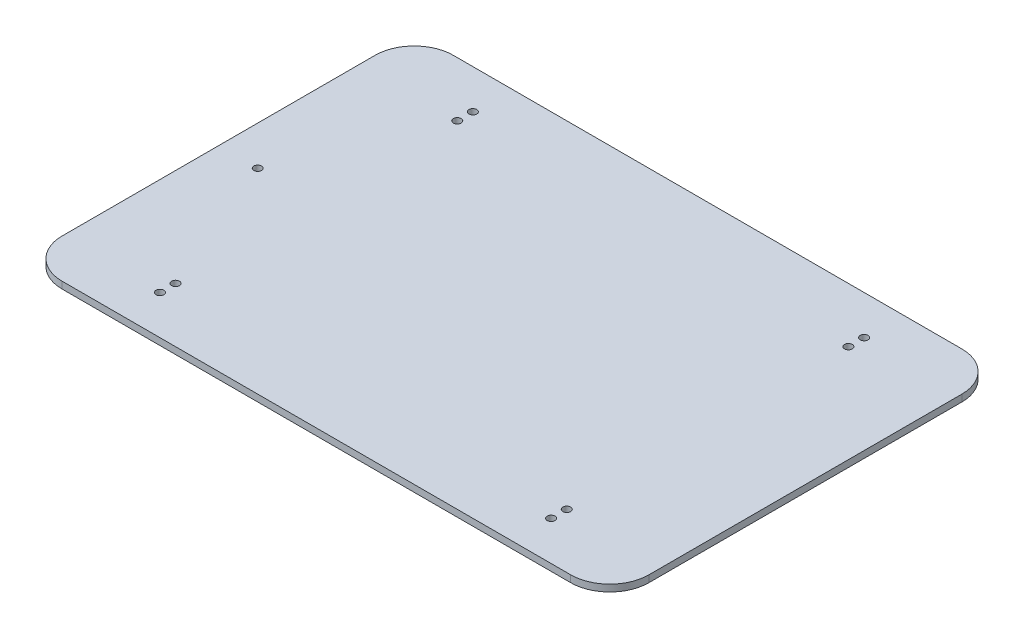
ISO-10303-21;
HEADER;
FILE_DESCRIPTION(('STEP AP214'),'2;1');
FILE_NAME('part.step','',(''),(''),'','','');
FILE_SCHEMA(('AUTOMOTIVE_DESIGN { 1 0 10303 214 1 1 1 1 }'));
ENDSEC;
DATA;
#1=APPLICATION_CONTEXT('core data for automotive mechanical design processes');
#2=APPLICATION_PROTOCOL_DEFINITION('international standard','automotive_design',2000,#1);
#3=PRODUCT_CONTEXT('',#1,'mechanical');
#4=PRODUCT('Part','Part','',(#3));
#5=PRODUCT_RELATED_PRODUCT_CATEGORY('part','',(#4));
#6=PRODUCT_DEFINITION_FORMATION('','',#4);
#7=PRODUCT_DEFINITION_CONTEXT('part definition',#1,'design');
#8=PRODUCT_DEFINITION('design','',#6,#7);
#9=PRODUCT_DEFINITION_SHAPE('','',#8);
#10=(LENGTH_UNIT() NAMED_UNIT(*) SI_UNIT(.MILLI.,.METRE.));
#11=(NAMED_UNIT(*) PLANE_ANGLE_UNIT() SI_UNIT($,.RADIAN.));
#12=(NAMED_UNIT(*) SI_UNIT($,.STERADIAN.) SOLID_ANGLE_UNIT());
#13=UNCERTAINTY_MEASURE_WITH_UNIT(LENGTH_MEASURE(1.E-05),#10,'distance_accuracy_value','');
#14=(GEOMETRIC_REPRESENTATION_CONTEXT(3) GLOBAL_UNCERTAINTY_ASSIGNED_CONTEXT((#13)) GLOBAL_UNIT_ASSIGNED_CONTEXT((#10,
#11,#12)) REPRESENTATION_CONTEXT('',''));
#15=CARTESIAN_POINT('',(0.,0.,0.));
#16=DIRECTION('',(0.,0.,1.));
#17=DIRECTION('',(1.,0.,0.));
#18=AXIS2_PLACEMENT_3D('',#15,#16,#17);
#19=CARTESIAN_POINT('',(130.,3.5,-80.));
#20=DIRECTION('',(0.,1.,0.));
#21=DIRECTION('',(0.,0.,1.));
#22=AXIS2_PLACEMENT_3D('',#19,#20,#21);
#23=PLANE('',#22);
#24=CARTESIAN_POINT('',(100.,3.5,-72.));
#25=DIRECTION('',(0.,1.,0.));
#26=DIRECTION('',(0.,0.,-1.));
#27=AXIS2_PLACEMENT_3D('',#24,#25,#26);
#28=CIRCLE('',#27,2.);
#29=CARTESIAN_POINT('',(100.,3.5,-74.));
#30=VERTEX_POINT('',#29);
#31=EDGE_CURVE('E300',#30,#30,#28,.T.);
#32=ORIENTED_EDGE('',*,*,#31,.F.);
#33=EDGE_LOOP('',(#32));
#34=FACE_BOUND('',#33,.T.);
#35=CARTESIAN_POINT('',(100.,3.5,72.));
#36=DIRECTION('',(0.,1.,0.));
#37=DIRECTION('',(0.,0.,1.));
#38=AXIS2_PLACEMENT_3D('',#35,#36,#37);
#39=CIRCLE('',#38,2.);
#40=CARTESIAN_POINT('',(100.,3.5,74.));
#41=VERTEX_POINT('',#40);
#42=EDGE_CURVE('E296',#41,#41,#39,.T.);
#43=ORIENTED_EDGE('',*,*,#42,.F.);
#44=EDGE_LOOP('',(#43));
#45=FACE_BOUND('',#44,.T.);
#46=CARTESIAN_POINT('',(-100.,3.5,72.));
#47=DIRECTION('',(0.,1.,0.));
#48=DIRECTION('',(0.,0.,-1.));
#49=AXIS2_PLACEMENT_3D('',#46,#47,#48);
#50=CIRCLE('',#49,2.);
#51=CARTESIAN_POINT('',(-100.,3.5,70.));
#52=VERTEX_POINT('',#51);
#53=EDGE_CURVE('E289',#52,#52,#50,.T.);
#54=ORIENTED_EDGE('',*,*,#53,.F.);
#55=EDGE_LOOP('',(#54));
#56=FACE_BOUND('',#55,.T.);
#57=CARTESIAN_POINT('',(-100.,3.5,-72.));
#58=DIRECTION('',(0.,1.,0.));
#59=DIRECTION('',(0.,0.,1.));
#60=AXIS2_PLACEMENT_3D('',#57,#58,#59);
#61=CIRCLE('',#60,2.);
#62=CARTESIAN_POINT('',(-100.,3.5,-70.));
#63=VERTEX_POINT('',#62);
#64=EDGE_CURVE('E167',#63,#63,#61,.T.);
#65=ORIENTED_EDGE('',*,*,#64,.F.);
#66=EDGE_LOOP('',(#65));
#67=FACE_BOUND('',#66,.T.);
#68=CARTESIAN_POINT('',(-100.,3.5,80.));
#69=DIRECTION('',(0.,1.,0.));
#70=DIRECTION('',(0.,0.,1.));
#71=AXIS2_PLACEMENT_3D('',#68,#69,#70);
#72=CIRCLE('',#71,2.);
#73=CARTESIAN_POINT('',(-100.,3.5,82.));
#74=VERTEX_POINT('',#73);
#75=EDGE_CURVE('E187',#74,#74,#72,.T.);
#76=ORIENTED_EDGE('',*,*,#75,.F.);
#77=EDGE_LOOP('',(#76));
#78=FACE_BOUND('',#77,.T.);
#79=CARTESIAN_POINT('',(100.,3.5,-80.));
#80=DIRECTION('',(0.,1.,0.));
#81=DIRECTION('',(0.,0.,1.));
#82=AXIS2_PLACEMENT_3D('',#79,#80,#81);
#83=CIRCLE('',#82,2.);
#84=CARTESIAN_POINT('',(100.,3.5,-78.));
#85=VERTEX_POINT('',#84);
#86=EDGE_CURVE('E199',#85,#85,#83,.T.);
#87=ORIENTED_EDGE('',*,*,#86,.F.);
#88=EDGE_LOOP('',(#87));
#89=FACE_BOUND('',#88,.T.);
#90=CARTESIAN_POINT('',(130.,3.5,-80.));
#91=DIRECTION('',(0.,1.,0.));
#92=DIRECTION('',(0.,0.,1.));
#93=AXIS2_PLACEMENT_3D('',#90,#91,#92);
#94=CIRCLE('',#93,20.);
#95=CARTESIAN_POINT('',(150.,3.5,-80.));
#96=VERTEX_POINT('',#95);
#97=CARTESIAN_POINT('',(130.,3.5,-100.));
#98=VERTEX_POINT('',#97);
#99=EDGE_CURVE('E151',#96,#98,#94,.T.);
#100=ORIENTED_EDGE('',*,*,#99,.T.);
#101=DIRECTION('',(-1.,0.,0.));
#102=VECTOR('',#101,1.);
#103=CARTESIAN_POINT('',(130.,3.5,-100.));
#104=LINE('',#103,#102);
#105=CARTESIAN_POINT('',(-130.,3.5,-100.));
#106=VERTEX_POINT('',#105);
#107=EDGE_CURVE('E99',#98,#106,#104,.T.);
#108=ORIENTED_EDGE('',*,*,#107,.T.);
#109=CARTESIAN_POINT('',(-130.,3.5,-80.));
#110=DIRECTION('',(0.,1.,0.));
#111=DIRECTION('',(0.,0.,1.));
#112=AXIS2_PLACEMENT_3D('',#109,#110,#111);
#113=CIRCLE('',#112,20.);
#114=CARTESIAN_POINT('',(-150.,3.5,-80.));
#115=VERTEX_POINT('',#114);
#116=EDGE_CURVE('E211',#106,#115,#113,.T.);
#117=ORIENTED_EDGE('',*,*,#116,.T.);
#118=DIRECTION('',(0.,0.,1.));
#119=VECTOR('',#118,1.);
#120=CARTESIAN_POINT('',(-150.,3.5,80.));
#121=LINE('',#120,#119);
#122=CARTESIAN_POINT('',(-150.,3.5,80.));
#123=VERTEX_POINT('',#122);
#124=EDGE_CURVE('E213',#115,#123,#121,.T.);
#125=ORIENTED_EDGE('',*,*,#124,.T.);
#126=CARTESIAN_POINT('',(-130.,3.5,80.));
#127=DIRECTION('',(0.,1.,0.));
#128=DIRECTION('',(0.,0.,-1.));
#129=AXIS2_PLACEMENT_3D('',#126,#127,#128);
#130=CIRCLE('',#129,20.);
#131=CARTESIAN_POINT('',(-130.,3.5,100.));
#132=VERTEX_POINT('',#131);
#133=EDGE_CURVE('E118',#123,#132,#130,.T.);
#134=ORIENTED_EDGE('',*,*,#133,.T.);
#135=DIRECTION('',(1.,0.,0.));
#136=VECTOR('',#135,1.);
#137=CARTESIAN_POINT('',(130.,3.5,100.));
#138=LINE('',#137,#136);
#139=CARTESIAN_POINT('',(130.,3.5,100.));
#140=VERTEX_POINT('',#139);
#141=EDGE_CURVE('E112',#132,#140,#138,.T.);
#142=ORIENTED_EDGE('',*,*,#141,.T.);
#143=CARTESIAN_POINT('',(130.,3.5,80.));
#144=DIRECTION('',(0.,1.,0.));
#145=DIRECTION('',(0.,0.,1.));
#146=AXIS2_PLACEMENT_3D('',#143,#144,#145);
#147=CIRCLE('',#146,20.);
#148=CARTESIAN_POINT('',(150.,3.5,80.));
#149=VERTEX_POINT('',#148);
#150=EDGE_CURVE('E116',#140,#149,#147,.T.);
#151=ORIENTED_EDGE('',*,*,#150,.T.);
#152=DIRECTION('',(0.,0.,-1.));
#153=VECTOR('',#152,1.);
#154=CARTESIAN_POINT('',(150.,3.5,80.));
#155=LINE('',#154,#153);
#156=EDGE_CURVE('E56',#149,#96,#155,.T.);
#157=ORIENTED_EDGE('',*,*,#156,.T.);
#158=EDGE_LOOP('',(#100,#108,#117,#125,#134,#142,#151,#157));
#159=FACE_BOUND('',#158,.T.);
#160=CARTESIAN_POINT('',(-100.,3.5,-80.));
#161=DIRECTION('',(0.,1.,0.));
#162=DIRECTION('',(0.,0.,1.));
#163=AXIS2_PLACEMENT_3D('',#160,#161,#162);
#164=CIRCLE('',#163,2.);
#165=CARTESIAN_POINT('',(-100.,3.5,-78.));
#166=VERTEX_POINT('',#165);
#167=EDGE_CURVE('E140',#166,#166,#164,.T.);
#168=ORIENTED_EDGE('',*,*,#167,.F.);
#169=EDGE_LOOP('',(#168));
#170=FACE_BOUND('',#169,.T.);
#171=CARTESIAN_POINT('',(100.,3.5,80.));
#172=DIRECTION('',(0.,1.,0.));
#173=DIRECTION('',(0.,0.,1.));
#174=AXIS2_PLACEMENT_3D('',#171,#172,#173);
#175=CIRCLE('',#174,2.);
#176=CARTESIAN_POINT('',(100.,3.5,82.));
#177=VERTEX_POINT('',#176);
#178=EDGE_CURVE('E193',#177,#177,#175,.T.);
#179=ORIENTED_EDGE('',*,*,#178,.F.);
#180=EDGE_LOOP('',(#179));
#181=FACE_BOUND('',#180,.T.);
#182=CARTESIAN_POINT('',(-130.,3.5,0.));
#183=DIRECTION('',(0.,1.,0.));
#184=DIRECTION('',(0.,0.,1.));
#185=AXIS2_PLACEMENT_3D('',#182,#183,#184);
#186=CIRCLE('',#185,2.);
#187=CARTESIAN_POINT('',(-130.,3.5,2.));
#188=VERTEX_POINT('',#187);
#189=EDGE_CURVE('E178',#188,#188,#186,.T.);
#190=ORIENTED_EDGE('',*,*,#189,.F.);
#191=EDGE_LOOP('',(#190));
#192=FACE_BOUND('',#191,.T.);
#193=ADVANCED_FACE('F37',(#34,#45,#56,#67,#78,#89,#159,#170,#181,#192),#23,.T.);
#194=CARTESIAN_POINT('',(130.,0.,-80.));
#195=DIRECTION('',(0.,1.,0.));
#196=DIRECTION('',(0.,0.,1.));
#197=AXIS2_PLACEMENT_3D('',#194,#195,#196);
#198=PLANE('',#197);
#199=CARTESIAN_POINT('',(100.,0.,-72.));
#200=DIRECTION('',(0.,1.,0.));
#201=DIRECTION('',(0.,0.,1.));
#202=AXIS2_PLACEMENT_3D('',#199,#200,#201);
#203=CIRCLE('',#202,2.);
#204=CARTESIAN_POINT('',(100.,0.,-70.));
#205=VERTEX_POINT('',#204);
#206=EDGE_CURVE('E41',#205,#205,#203,.T.);
#207=ORIENTED_EDGE('',*,*,#206,.T.);
#208=EDGE_LOOP('',(#207));
#209=FACE_BOUND('',#208,.T.);
#210=CARTESIAN_POINT('',(100.,0.,72.));
#211=DIRECTION('',(0.,1.,0.));
#212=DIRECTION('',(0.,0.,1.));
#213=AXIS2_PLACEMENT_3D('',#210,#211,#212);
#214=CIRCLE('',#213,2.);
#215=CARTESIAN_POINT('',(100.,0.,74.));
#216=VERTEX_POINT('',#215);
#217=EDGE_CURVE('E169',#216,#216,#214,.T.);
#218=ORIENTED_EDGE('',*,*,#217,.T.);
#219=EDGE_LOOP('',(#218));
#220=FACE_BOUND('',#219,.T.);
#221=CARTESIAN_POINT('',(-100.,0.,72.));
#222=DIRECTION('',(0.,1.,0.));
#223=DIRECTION('',(0.,0.,1.));
#224=AXIS2_PLACEMENT_3D('',#221,#222,#223);
#225=CIRCLE('',#224,2.);
#226=CARTESIAN_POINT('',(-100.,0.,74.));
#227=VERTEX_POINT('',#226);
#228=EDGE_CURVE('E166',#227,#227,#225,.T.);
#229=ORIENTED_EDGE('',*,*,#228,.T.);
#230=EDGE_LOOP('',(#229));
#231=FACE_BOUND('',#230,.T.);
#232=CARTESIAN_POINT('',(-100.,0.,-72.));
#233=DIRECTION('',(0.,1.,0.));
#234=DIRECTION('',(0.,0.,1.));
#235=AXIS2_PLACEMENT_3D('',#232,#233,#234);
#236=CIRCLE('',#235,2.);
#237=CARTESIAN_POINT('',(-100.,0.,-70.));
#238=VERTEX_POINT('',#237);
#239=EDGE_CURVE('E163',#238,#238,#236,.T.);
#240=ORIENTED_EDGE('',*,*,#239,.T.);
#241=EDGE_LOOP('',(#240));
#242=FACE_BOUND('',#241,.T.);
#243=CARTESIAN_POINT('',(130.,0.,-80.));
#244=DIRECTION('',(0.,1.,0.));
#245=DIRECTION('',(0.,0.,1.));
#246=AXIS2_PLACEMENT_3D('',#243,#244,#245);
#247=CIRCLE('',#246,20.);
#248=CARTESIAN_POINT('',(150.,0.,-80.));
#249=VERTEX_POINT('',#248);
#250=CARTESIAN_POINT('',(130.,0.,-100.));
#251=VERTEX_POINT('',#250);
#252=EDGE_CURVE('E136',#249,#251,#247,.T.);
#253=ORIENTED_EDGE('',*,*,#252,.F.);
#254=DIRECTION('',(0.,0.,-1.));
#255=VECTOR('',#254,1.);
#256=CARTESIAN_POINT('',(150.,0.,80.));
#257=LINE('',#256,#255);
#258=CARTESIAN_POINT('',(150.,0.,80.));
#259=VERTEX_POINT('',#258);
#260=EDGE_CURVE('E91',#259,#249,#257,.T.);
#261=ORIENTED_EDGE('',*,*,#260,.F.);
#262=CARTESIAN_POINT('',(130.,0.,80.));
#263=DIRECTION('',(0.,1.,0.));
#264=DIRECTION('',(0.,0.,1.));
#265=AXIS2_PLACEMENT_3D('',#262,#263,#264);
#266=CIRCLE('',#265,20.);
#267=CARTESIAN_POINT('',(130.,0.,100.));
#268=VERTEX_POINT('',#267);
#269=EDGE_CURVE('E85',#268,#259,#266,.T.);
#270=ORIENTED_EDGE('',*,*,#269,.F.);
#271=DIRECTION('',(1.,0.,0.));
#272=VECTOR('',#271,1.);
#273=CARTESIAN_POINT('',(130.,0.,100.));
#274=LINE('',#273,#272);
#275=CARTESIAN_POINT('',(-130.,0.,100.));
#276=VERTEX_POINT('',#275);
#277=EDGE_CURVE('E126',#276,#268,#274,.T.);
#278=ORIENTED_EDGE('',*,*,#277,.F.);
#279=CARTESIAN_POINT('',(-130.,0.,80.));
#280=DIRECTION('',(0.,1.,0.));
#281=DIRECTION('',(0.,0.,-1.));
#282=AXIS2_PLACEMENT_3D('',#279,#280,#281);
#283=CIRCLE('',#282,20.);
#284=CARTESIAN_POINT('',(-150.,0.,80.));
#285=VERTEX_POINT('',#284);
#286=EDGE_CURVE('E146',#285,#276,#283,.T.);
#287=ORIENTED_EDGE('',*,*,#286,.F.);
#288=DIRECTION('',(0.,0.,1.));
#289=VECTOR('',#288,1.);
#290=CARTESIAN_POINT('',(-150.,0.,80.));
#291=LINE('',#290,#289);
#292=CARTESIAN_POINT('',(-150.,0.,-80.));
#293=VERTEX_POINT('',#292);
#294=EDGE_CURVE('E144',#293,#285,#291,.T.);
#295=ORIENTED_EDGE('',*,*,#294,.F.);
#296=CARTESIAN_POINT('',(-130.,0.,-80.));
#297=DIRECTION('',(0.,1.,0.));
#298=DIRECTION('',(0.,0.,1.));
#299=AXIS2_PLACEMENT_3D('',#296,#297,#298);
#300=CIRCLE('',#299,20.);
#301=CARTESIAN_POINT('',(-130.,0.,-100.));
#302=VERTEX_POINT('',#301);
#303=EDGE_CURVE('E142',#302,#293,#300,.T.);
#304=ORIENTED_EDGE('',*,*,#303,.F.);
#305=DIRECTION('',(-1.,0.,0.));
#306=VECTOR('',#305,1.);
#307=CARTESIAN_POINT('',(130.,0.,-100.));
#308=LINE('',#307,#306);
#309=EDGE_CURVE('E139',#251,#302,#308,.T.);
#310=ORIENTED_EDGE('',*,*,#309,.F.);
#311=EDGE_LOOP('',(#253,#261,#270,#278,#287,#295,#304,#310));
#312=FACE_BOUND('',#311,.T.);
#313=CARTESIAN_POINT('',(-100.,0.,-80.));
#314=DIRECTION('',(0.,1.,0.));
#315=DIRECTION('',(0.,0.,1.));
#316=AXIS2_PLACEMENT_3D('',#313,#314,#315);
#317=CIRCLE('',#316,2.);
#318=CARTESIAN_POINT('',(-100.,0.,-78.));
#319=VERTEX_POINT('',#318);
#320=EDGE_CURVE('E202',#319,#319,#317,.T.);
#321=ORIENTED_EDGE('',*,*,#320,.T.);
#322=EDGE_LOOP('',(#321));
#323=FACE_BOUND('',#322,.T.);
#324=CARTESIAN_POINT('',(100.,0.,-80.));
#325=DIRECTION('',(0.,1.,0.));
#326=DIRECTION('',(0.,0.,1.));
#327=AXIS2_PLACEMENT_3D('',#324,#325,#326);
#328=CIRCLE('',#327,2.);
#329=CARTESIAN_POINT('',(100.,0.,-78.));
#330=VERTEX_POINT('',#329);
#331=EDGE_CURVE('E196',#330,#330,#328,.T.);
#332=ORIENTED_EDGE('',*,*,#331,.T.);
#333=EDGE_LOOP('',(#332));
#334=FACE_BOUND('',#333,.T.);
#335=CARTESIAN_POINT('',(100.,0.,80.));
#336=DIRECTION('',(0.,1.,0.));
#337=DIRECTION('',(0.,0.,1.));
#338=AXIS2_PLACEMENT_3D('',#335,#336,#337);
#339=CIRCLE('',#338,2.);
#340=CARTESIAN_POINT('',(100.,0.,82.));
#341=VERTEX_POINT('',#340);
#342=EDGE_CURVE('E190',#341,#341,#339,.T.);
#343=ORIENTED_EDGE('',*,*,#342,.T.);
#344=EDGE_LOOP('',(#343));
#345=FACE_BOUND('',#344,.T.);
#346=CARTESIAN_POINT('',(-100.,0.,80.));
#347=DIRECTION('',(0.,1.,0.));
#348=DIRECTION('',(0.,0.,1.));
#349=AXIS2_PLACEMENT_3D('',#346,#347,#348);
#350=CIRCLE('',#349,2.);
#351=CARTESIAN_POINT('',(-100.,0.,82.));
#352=VERTEX_POINT('',#351);
#353=EDGE_CURVE('E183',#352,#352,#350,.T.);
#354=ORIENTED_EDGE('',*,*,#353,.T.);
#355=EDGE_LOOP('',(#354));
#356=FACE_BOUND('',#355,.T.);
#357=CARTESIAN_POINT('',(-130.,0.,0.));
#358=DIRECTION('',(0.,1.,0.));
#359=DIRECTION('',(0.,0.,1.));
#360=AXIS2_PLACEMENT_3D('',#357,#358,#359);
#361=CIRCLE('',#360,2.);
#362=CARTESIAN_POINT('',(-130.,0.,2.));
#363=VERTEX_POINT('',#362);
#364=EDGE_CURVE('E174',#363,#363,#361,.T.);
#365=ORIENTED_EDGE('',*,*,#364,.T.);
#366=EDGE_LOOP('',(#365));
#367=FACE_BOUND('',#366,.T.);
#368=ADVANCED_FACE('F226',(#209,#220,#231,#242,#312,#323,#334,#345,#356,#367),#198,.F.);
#369=CARTESIAN_POINT('',(130.,3.5,-80.));
#370=DIRECTION('',(0.,-1.,0.));
#371=DIRECTION('',(0.,0.,-1.));
#372=AXIS2_PLACEMENT_3D('',#369,#370,#371);
#373=CYLINDRICAL_SURFACE('',#372,20.);
#374=ORIENTED_EDGE('',*,*,#252,.T.);
#375=DIRECTION('',(0.,-1.,0.));
#376=VECTOR('',#375,1.);
#377=CARTESIAN_POINT('',(130.,3.5,-100.));
#378=LINE('',#377,#376);
#379=EDGE_CURVE('E11',#98,#251,#378,.T.);
#380=ORIENTED_EDGE('',*,*,#379,.F.);
#381=ORIENTED_EDGE('',*,*,#99,.F.);
#382=DIRECTION('',(0.,-1.,0.));
#383=VECTOR('',#382,1.);
#384=CARTESIAN_POINT('',(150.,3.5,-80.));
#385=LINE('',#384,#383);
#386=EDGE_CURVE('E132',#96,#249,#385,.T.);
#387=ORIENTED_EDGE('',*,*,#386,.T.);
#388=EDGE_LOOP('',(#374,#380,#381,#387));
#389=FACE_BOUND('',#388,.T.);
#390=ADVANCED_FACE('F39',(#389),#373,.T.);
#391=CARTESIAN_POINT('',(130.,3.5,-100.));
#392=DIRECTION('',(0.,0.,1.));
#393=DIRECTION('',(1.,0.,0.));
#394=AXIS2_PLACEMENT_3D('',#391,#392,#393);
#395=PLANE('',#394);
#396=ORIENTED_EDGE('',*,*,#309,.T.);
#397=DIRECTION('',(0.,-1.,0.));
#398=VECTOR('',#397,1.);
#399=CARTESIAN_POINT('',(-130.,3.5,-100.));
#400=LINE('',#399,#398);
#401=EDGE_CURVE('E47',#106,#302,#400,.T.);
#402=ORIENTED_EDGE('',*,*,#401,.F.);
#403=ORIENTED_EDGE('',*,*,#107,.F.);
#404=ORIENTED_EDGE('',*,*,#379,.T.);
#405=EDGE_LOOP('',(#396,#402,#403,#404));
#406=FACE_BOUND('',#405,.T.);
#407=ADVANCED_FACE('F348',(#406),#395,.F.);
#408=CARTESIAN_POINT('',(-130.,3.5,-80.));
#409=DIRECTION('',(0.,-1.,0.));
#410=DIRECTION('',(0.,0.,-1.));
#411=AXIS2_PLACEMENT_3D('',#408,#409,#410);
#412=CYLINDRICAL_SURFACE('',#411,20.);
#413=ORIENTED_EDGE('',*,*,#303,.T.);
#414=DIRECTION('',(0.,-1.,0.));
#415=VECTOR('',#414,1.);
#416=CARTESIAN_POINT('',(-150.,3.5,-80.));
#417=LINE('',#416,#415);
#418=EDGE_CURVE('E158',#115,#293,#417,.T.);
#419=ORIENTED_EDGE('',*,*,#418,.F.);
#420=ORIENTED_EDGE('',*,*,#116,.F.);
#421=ORIENTED_EDGE('',*,*,#401,.T.);
#422=EDGE_LOOP('',(#413,#419,#420,#421));
#423=FACE_BOUND('',#422,.T.);
#424=ADVANCED_FACE('F354',(#423),#412,.T.);
#425=CARTESIAN_POINT('',(-150.,3.5,80.));
#426=DIRECTION('',(1.,0.,0.));
#427=DIRECTION('',(0.,0.,-1.));
#428=AXIS2_PLACEMENT_3D('',#425,#426,#427);
#429=PLANE('',#428);
#430=ORIENTED_EDGE('',*,*,#294,.T.);
#431=DIRECTION('',(0.,-1.,0.));
#432=VECTOR('',#431,1.);
#433=CARTESIAN_POINT('',(-150.,3.5,80.));
#434=LINE('',#433,#432);
#435=EDGE_CURVE('E155',#123,#285,#434,.T.);
#436=ORIENTED_EDGE('',*,*,#435,.F.);
#437=ORIENTED_EDGE('',*,*,#124,.F.);
#438=ORIENTED_EDGE('',*,*,#418,.T.);
#439=EDGE_LOOP('',(#430,#436,#437,#438));
#440=FACE_BOUND('',#439,.T.);
#441=ADVANCED_FACE('F219',(#440),#429,.F.);
#442=CARTESIAN_POINT('',(-130.,3.5,80.));
#443=DIRECTION('',(0.,-1.,0.));
#444=DIRECTION('',(0.,0.,-1.));
#445=AXIS2_PLACEMENT_3D('',#442,#443,#444);
#446=CYLINDRICAL_SURFACE('',#445,20.);
#447=ORIENTED_EDGE('',*,*,#286,.T.);
#448=DIRECTION('',(0.,-1.,0.));
#449=VECTOR('',#448,1.);
#450=CARTESIAN_POINT('',(-130.,3.5,100.));
#451=LINE('',#450,#449);
#452=EDGE_CURVE('E127',#132,#276,#451,.T.);
#453=ORIENTED_EDGE('',*,*,#452,.F.);
#454=ORIENTED_EDGE('',*,*,#133,.F.);
#455=ORIENTED_EDGE('',*,*,#435,.T.);
#456=EDGE_LOOP('',(#447,#453,#454,#455));
#457=FACE_BOUND('',#456,.T.);
#458=ADVANCED_FACE('F223',(#457),#446,.T.);
#459=CARTESIAN_POINT('',(130.,3.5,100.));
#460=DIRECTION('',(0.,0.,-1.));
#461=DIRECTION('',(-1.,0.,0.));
#462=AXIS2_PLACEMENT_3D('',#459,#460,#461);
#463=PLANE('',#462);
#464=ORIENTED_EDGE('',*,*,#277,.T.);
#465=DIRECTION('',(0.,-1.,0.));
#466=VECTOR('',#465,1.);
#467=CARTESIAN_POINT('',(130.,3.5,100.));
#468=LINE('',#467,#466);
#469=EDGE_CURVE('E123',#140,#268,#468,.T.);
#470=ORIENTED_EDGE('',*,*,#469,.F.);
#471=ORIENTED_EDGE('',*,*,#141,.F.);
#472=ORIENTED_EDGE('',*,*,#452,.T.);
#473=EDGE_LOOP('',(#464,#470,#471,#472));
#474=FACE_BOUND('',#473,.T.);
#475=ADVANCED_FACE('F124',(#474),#463,.F.);
#476=CARTESIAN_POINT('',(130.,3.5,80.));
#477=DIRECTION('',(0.,-1.,0.));
#478=DIRECTION('',(0.,0.,-1.));
#479=AXIS2_PLACEMENT_3D('',#476,#477,#478);
#480=CYLINDRICAL_SURFACE('',#479,20.);
#481=ORIENTED_EDGE('',*,*,#269,.T.);
#482=DIRECTION('',(0.,-1.,0.));
#483=VECTOR('',#482,1.);
#484=CARTESIAN_POINT('',(150.,3.5,80.));
#485=LINE('',#484,#483);
#486=EDGE_CURVE('E128',#149,#259,#485,.T.);
#487=ORIENTED_EDGE('',*,*,#486,.F.);
#488=ORIENTED_EDGE('',*,*,#150,.F.);
#489=ORIENTED_EDGE('',*,*,#469,.T.);
#490=EDGE_LOOP('',(#481,#487,#488,#489));
#491=FACE_BOUND('',#490,.T.);
#492=ADVANCED_FACE('F130',(#491),#480,.T.);
#493=CARTESIAN_POINT('',(150.,3.5,80.));
#494=DIRECTION('',(-1.,0.,0.));
#495=DIRECTION('',(0.,0.,1.));
#496=AXIS2_PLACEMENT_3D('',#493,#494,#495);
#497=PLANE('',#496);
#498=ORIENTED_EDGE('',*,*,#260,.T.);
#499=ORIENTED_EDGE('',*,*,#386,.F.);
#500=ORIENTED_EDGE('',*,*,#156,.F.);
#501=ORIENTED_EDGE('',*,*,#486,.T.);
#502=EDGE_LOOP('',(#498,#499,#500,#501));
#503=FACE_BOUND('',#502,.T.);
#504=ADVANCED_FACE('F232',(#503),#497,.F.);
#505=CARTESIAN_POINT('',(-100.,3.5,-80.));
#506=DIRECTION('',(0.,-1.,0.));
#507=DIRECTION('',(0.,0.,-1.));
#508=AXIS2_PLACEMENT_3D('',#505,#506,#507);
#509=CYLINDRICAL_SURFACE('',#508,2.);
#510=ORIENTED_EDGE('',*,*,#167,.T.);
#511=EDGE_LOOP('',(#510));
#512=FACE_BOUND('',#511,.T.);
#513=ORIENTED_EDGE('',*,*,#320,.F.);
#514=EDGE_LOOP('',(#513));
#515=FACE_BOUND('',#514,.T.);
#516=ADVANCED_FACE('F234',(#512,#515),#509,.F.);
#517=CARTESIAN_POINT('',(100.,3.5,-80.));
#518=DIRECTION('',(0.,-1.,0.));
#519=DIRECTION('',(0.,0.,-1.));
#520=AXIS2_PLACEMENT_3D('',#517,#518,#519);
#521=CYLINDRICAL_SURFACE('',#520,2.);
#522=ORIENTED_EDGE('',*,*,#86,.T.);
#523=EDGE_LOOP('',(#522));
#524=FACE_BOUND('',#523,.T.);
#525=ORIENTED_EDGE('',*,*,#331,.F.);
#526=EDGE_LOOP('',(#525));
#527=FACE_BOUND('',#526,.T.);
#528=ADVANCED_FACE('F240',(#524,#527),#521,.F.);
#529=CARTESIAN_POINT('',(100.,3.5,80.));
#530=DIRECTION('',(0.,-1.,0.));
#531=DIRECTION('',(0.,0.,-1.));
#532=AXIS2_PLACEMENT_3D('',#529,#530,#531);
#533=CYLINDRICAL_SURFACE('',#532,2.);
#534=ORIENTED_EDGE('',*,*,#178,.T.);
#535=EDGE_LOOP('',(#534));
#536=FACE_BOUND('',#535,.T.);
#537=ORIENTED_EDGE('',*,*,#342,.F.);
#538=EDGE_LOOP('',(#537));
#539=FACE_BOUND('',#538,.T.);
#540=ADVANCED_FACE('F257',(#536,#539),#533,.F.);
#541=CARTESIAN_POINT('',(-100.,3.5,80.));
#542=DIRECTION('',(0.,-1.,0.));
#543=DIRECTION('',(0.,0.,-1.));
#544=AXIS2_PLACEMENT_3D('',#541,#542,#543);
#545=CYLINDRICAL_SURFACE('',#544,2.);
#546=ORIENTED_EDGE('',*,*,#75,.T.);
#547=EDGE_LOOP('',(#546));
#548=FACE_BOUND('',#547,.T.);
#549=ORIENTED_EDGE('',*,*,#353,.F.);
#550=EDGE_LOOP('',(#549));
#551=FACE_BOUND('',#550,.T.);
#552=ADVANCED_FACE('F261',(#548,#551),#545,.F.);
#553=CARTESIAN_POINT('',(-130.,3.5,0.));
#554=DIRECTION('',(0.,-1.,0.));
#555=DIRECTION('',(0.,0.,-1.));
#556=AXIS2_PLACEMENT_3D('',#553,#554,#555);
#557=CYLINDRICAL_SURFACE('',#556,2.);
#558=ORIENTED_EDGE('',*,*,#189,.T.);
#559=EDGE_LOOP('',(#558));
#560=FACE_BOUND('',#559,.T.);
#561=ORIENTED_EDGE('',*,*,#364,.F.);
#562=EDGE_LOOP('',(#561));
#563=FACE_BOUND('',#562,.T.);
#564=ADVANCED_FACE('F265',(#560,#563),#557,.F.);
#565=CARTESIAN_POINT('',(-100.,-6.5,-72.));
#566=DIRECTION('',(0.,1.,0.));
#567=DIRECTION('',(0.,0.,1.));
#568=AXIS2_PLACEMENT_3D('',#565,#566,#567);
#569=CYLINDRICAL_SURFACE('',#568,2.);
#570=ORIENTED_EDGE('',*,*,#64,.T.);
#571=EDGE_LOOP('',(#570));
#572=FACE_BOUND('',#571,.T.);
#573=ORIENTED_EDGE('',*,*,#239,.F.);
#574=EDGE_LOOP('',(#573));
#575=FACE_BOUND('',#574,.T.);
#576=ADVANCED_FACE('F268',(#572,#575),#569,.F.);
#577=CARTESIAN_POINT('',(-100.,-6.5,72.));
#578=DIRECTION('',(0.,1.,0.));
#579=DIRECTION('',(0.,0.,1.));
#580=AXIS2_PLACEMENT_3D('',#577,#578,#579);
#581=CYLINDRICAL_SURFACE('',#580,2.);
#582=ORIENTED_EDGE('',*,*,#53,.T.);
#583=EDGE_LOOP('',(#582));
#584=FACE_BOUND('',#583,.T.);
#585=ORIENTED_EDGE('',*,*,#228,.F.);
#586=EDGE_LOOP('',(#585));
#587=FACE_BOUND('',#586,.T.);
#588=ADVANCED_FACE('F272',(#584,#587),#581,.F.);
#589=CARTESIAN_POINT('',(100.,-6.5,72.));
#590=DIRECTION('',(0.,1.,0.));
#591=DIRECTION('',(0.,0.,1.));
#592=AXIS2_PLACEMENT_3D('',#589,#590,#591);
#593=CYLINDRICAL_SURFACE('',#592,2.);
#594=ORIENTED_EDGE('',*,*,#42,.T.);
#595=EDGE_LOOP('',(#594));
#596=FACE_BOUND('',#595,.T.);
#597=ORIENTED_EDGE('',*,*,#217,.F.);
#598=EDGE_LOOP('',(#597));
#599=FACE_BOUND('',#598,.T.);
#600=ADVANCED_FACE('F277',(#596,#599),#593,.F.);
#601=CARTESIAN_POINT('',(100.,-6.5,-72.));
#602=DIRECTION('',(0.,1.,0.));
#603=DIRECTION('',(0.,0.,1.));
#604=AXIS2_PLACEMENT_3D('',#601,#602,#603);
#605=CYLINDRICAL_SURFACE('',#604,2.);
#606=ORIENTED_EDGE('',*,*,#31,.T.);
#607=EDGE_LOOP('',(#606));
#608=FACE_BOUND('',#607,.T.);
#609=ORIENTED_EDGE('',*,*,#206,.F.);
#610=EDGE_LOOP('',(#609));
#611=FACE_BOUND('',#610,.T.);
#612=ADVANCED_FACE('F274',(#608,#611),#605,.F.);
#613=CLOSED_SHELL('',(#193,#368,#390,#407,#424,#441,#458,#475,#492,#504,#516,#528,#540,#552,
#564,#576,#588,#600,#612));
#614=MANIFOLD_SOLID_BREP('B2',#613);
#615=ADVANCED_BREP_SHAPE_REPRESENTATION('',(#18,#614),#14);
#616=SHAPE_DEFINITION_REPRESENTATION(#9,#615);
ENDSEC;
END-ISO-10303-21;
